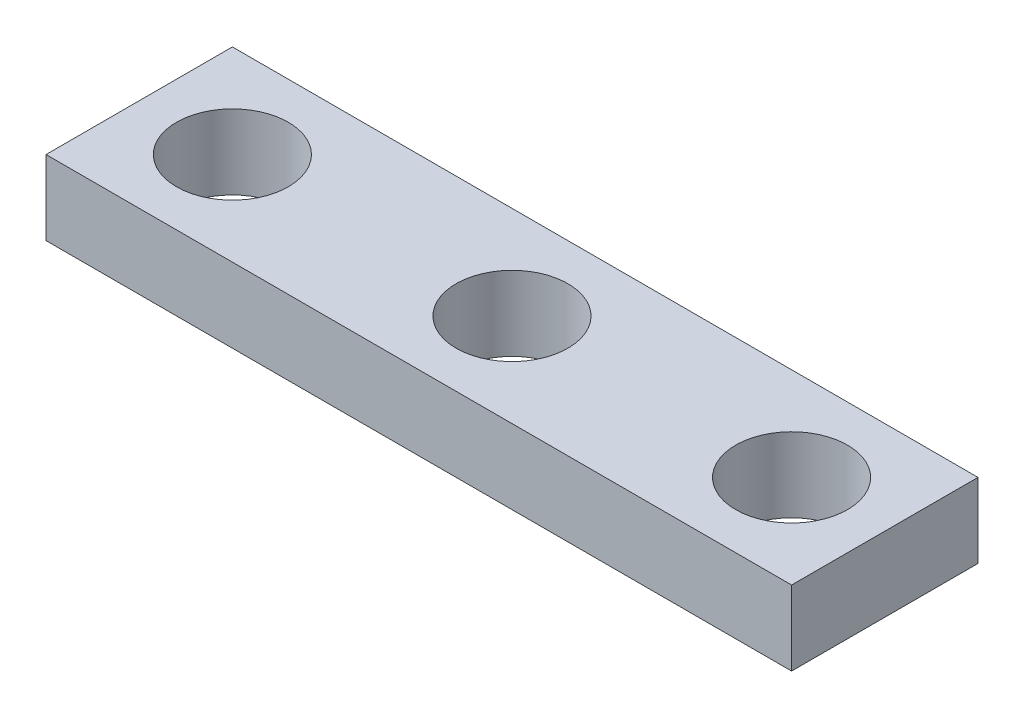
ISO-10303-21;
HEADER;
FILE_DESCRIPTION(('STEP AP214'),'2;1');
FILE_NAME('part.step','',(''),(''),'','','');
FILE_SCHEMA(('AUTOMOTIVE_DESIGN { 1 0 10303 214 1 1 1 1 }'));
ENDSEC;
DATA;
#1=APPLICATION_CONTEXT('core data for automotive mechanical design processes');
#2=APPLICATION_PROTOCOL_DEFINITION('international standard','automotive_design',2000,#1);
#3=PRODUCT_CONTEXT('',#1,'mechanical');
#4=PRODUCT('Part','Part','',(#3));
#5=PRODUCT_RELATED_PRODUCT_CATEGORY('part','',(#4));
#6=PRODUCT_DEFINITION_FORMATION('','',#4);
#7=PRODUCT_DEFINITION_CONTEXT('part definition',#1,'design');
#8=PRODUCT_DEFINITION('design','',#6,#7);
#9=PRODUCT_DEFINITION_SHAPE('','',#8);
#10=(LENGTH_UNIT() NAMED_UNIT(*) SI_UNIT(.MILLI.,.METRE.));
#11=(NAMED_UNIT(*) PLANE_ANGLE_UNIT() SI_UNIT($,.RADIAN.));
#12=(NAMED_UNIT(*) SI_UNIT($,.STERADIAN.) SOLID_ANGLE_UNIT());
#13=UNCERTAINTY_MEASURE_WITH_UNIT(LENGTH_MEASURE(1.E-05),#10,'distance_accuracy_value','');
#14=(GEOMETRIC_REPRESENTATION_CONTEXT(3) GLOBAL_UNCERTAINTY_ASSIGNED_CONTEXT((#13)) GLOBAL_UNIT_ASSIGNED_CONTEXT((#10,
#11,#12)) REPRESENTATION_CONTEXT('',''));
#15=CARTESIAN_POINT('',(0.,0.,0.));
#16=DIRECTION('',(0.,0.,1.));
#17=DIRECTION('',(1.,0.,0.));
#18=AXIS2_PLACEMENT_3D('',#15,#16,#17);
#19=CARTESIAN_POINT('',(0.,2.,0.));
#20=DIRECTION('',(0.,-1.,0.));
#21=DIRECTION('',(0.,0.,-1.));
#22=AXIS2_PLACEMENT_3D('',#19,#20,#21);
#23=PLANE('',#22);
#24=DIRECTION('',(0.,0.,-1.));
#25=VECTOR('',#24,1.);
#26=CARTESIAN_POINT('',(10.,2.,2.5));
#27=LINE('',#26,#25);
#28=CARTESIAN_POINT('',(10.,2.,2.5));
#29=VERTEX_POINT('',#28);
#30=CARTESIAN_POINT('',(10.,2.,-2.5));
#31=VERTEX_POINT('',#30);
#32=EDGE_CURVE('E98',#29,#31,#27,.T.);
#33=ORIENTED_EDGE('',*,*,#32,.T.);
#34=DIRECTION('',(-1.,0.,0.));
#35=VECTOR('',#34,1.);
#36=CARTESIAN_POINT('',(-10.,2.,-2.5));
#37=LINE('',#36,#35);
#38=CARTESIAN_POINT('',(-10.,2.,-2.5));
#39=VERTEX_POINT('',#38);
#40=EDGE_CURVE('E93',#31,#39,#37,.T.);
#41=ORIENTED_EDGE('',*,*,#40,.T.);
#42=DIRECTION('',(0.,0.,1.));
#43=VECTOR('',#42,1.);
#44=CARTESIAN_POINT('',(-10.,2.,2.5));
#45=LINE('',#44,#43);
#46=CARTESIAN_POINT('',(-10.,2.,2.5));
#47=VERTEX_POINT('',#46);
#48=EDGE_CURVE('E96',#39,#47,#45,.T.);
#49=ORIENTED_EDGE('',*,*,#48,.T.);
#50=DIRECTION('',(1.,0.,0.));
#51=VECTOR('',#50,1.);
#52=CARTESIAN_POINT('',(-10.,2.,2.5));
#53=LINE('',#52,#51);
#54=EDGE_CURVE('E63',#47,#29,#53,.T.);
#55=ORIENTED_EDGE('',*,*,#54,.T.);
#56=EDGE_LOOP('',(#33,#41,#49,#55));
#57=FACE_BOUND('',#56,.T.);
#58=CARTESIAN_POINT('',(-7.5,2.,0.));
#59=DIRECTION('',(0.,1.,0.));
#60=DIRECTION('',(0.,0.,1.));
#61=AXIS2_PLACEMENT_3D('',#58,#59,#60);
#62=CIRCLE('',#61,1.5);
#63=CARTESIAN_POINT('',(-7.5,2.,1.5));
#64=VERTEX_POINT('',#63);
#65=EDGE_CURVE('E118',#64,#64,#62,.T.);
#66=ORIENTED_EDGE('',*,*,#65,.F.);
#67=EDGE_LOOP('',(#66));
#68=FACE_BOUND('',#67,.T.);
#69=CARTESIAN_POINT('',(7.5,2.,0.));
#70=DIRECTION('',(0.,1.,0.));
#71=DIRECTION('',(0.,0.,1.));
#72=AXIS2_PLACEMENT_3D('',#69,#70,#71);
#73=CIRCLE('',#72,1.5);
#74=CARTESIAN_POINT('',(7.5,2.,1.5));
#75=VERTEX_POINT('',#74);
#76=EDGE_CURVE('E140',#75,#75,#73,.T.);
#77=ORIENTED_EDGE('',*,*,#76,.F.);
#78=EDGE_LOOP('',(#77));
#79=FACE_BOUND('',#78,.T.);
#80=CARTESIAN_POINT('',(0.,2.,0.));
#81=DIRECTION('',(0.,1.,0.));
#82=DIRECTION('',(0.,0.,1.));
#83=AXIS2_PLACEMENT_3D('',#80,#81,#82);
#84=CIRCLE('',#83,1.5);
#85=CARTESIAN_POINT('',(0.,2.,1.5));
#86=VERTEX_POINT('',#85);
#87=EDGE_CURVE('E148',#86,#86,#84,.T.);
#88=ORIENTED_EDGE('',*,*,#87,.F.);
#89=EDGE_LOOP('',(#88));
#90=FACE_BOUND('',#89,.T.);
#91=ADVANCED_FACE('F45',(#57,#68,#79,#90),#23,.F.);
#92=CARTESIAN_POINT('',(0.,0.,0.));
#93=DIRECTION('',(0.,-1.,0.));
#94=DIRECTION('',(0.,0.,-1.));
#95=AXIS2_PLACEMENT_3D('',#92,#93,#94);
#96=PLANE('',#95);
#97=CARTESIAN_POINT('',(7.5,0.,0.));
#98=DIRECTION('',(0.,1.,0.));
#99=DIRECTION('',(0.,0.,1.));
#100=AXIS2_PLACEMENT_3D('',#97,#98,#99);
#101=CIRCLE('',#100,1.5);
#102=CARTESIAN_POINT('',(7.5,0.,1.5));
#103=VERTEX_POINT('',#102);
#104=EDGE_CURVE('E144',#103,#103,#101,.T.);
#105=ORIENTED_EDGE('',*,*,#104,.T.);
#106=EDGE_LOOP('',(#105));
#107=FACE_BOUND('',#106,.T.);
#108=DIRECTION('',(0.,0.,-1.));
#109=VECTOR('',#108,1.);
#110=CARTESIAN_POINT('',(10.,0.,2.5));
#111=LINE('',#110,#109);
#112=CARTESIAN_POINT('',(10.,0.,2.5));
#113=VERTEX_POINT('',#112);
#114=CARTESIAN_POINT('',(10.,0.,-2.5));
#115=VERTEX_POINT('',#114);
#116=EDGE_CURVE('E114',#113,#115,#111,.T.);
#117=ORIENTED_EDGE('',*,*,#116,.F.);
#118=DIRECTION('',(1.,0.,0.));
#119=VECTOR('',#118,1.);
#120=CARTESIAN_POINT('',(-10.,0.,2.5));
#121=LINE('',#120,#119);
#122=CARTESIAN_POINT('',(-10.,0.,2.5));
#123=VERTEX_POINT('',#122);
#124=EDGE_CURVE('E86',#123,#113,#121,.T.);
#125=ORIENTED_EDGE('',*,*,#124,.F.);
#126=DIRECTION('',(0.,0.,1.));
#127=VECTOR('',#126,1.);
#128=CARTESIAN_POINT('',(-10.,0.,2.5));
#129=LINE('',#128,#127);
#130=CARTESIAN_POINT('',(-10.,0.,-2.5));
#131=VERTEX_POINT('',#130);
#132=EDGE_CURVE('E80',#131,#123,#129,.T.);
#133=ORIENTED_EDGE('',*,*,#132,.F.);
#134=DIRECTION('',(-1.,0.,0.));
#135=VECTOR('',#134,1.);
#136=CARTESIAN_POINT('',(-10.,0.,-2.5));
#137=LINE('',#136,#135);
#138=EDGE_CURVE('E103',#115,#131,#137,.T.);
#139=ORIENTED_EDGE('',*,*,#138,.F.);
#140=EDGE_LOOP('',(#117,#125,#133,#139));
#141=FACE_BOUND('',#140,.T.);
#142=CARTESIAN_POINT('',(-7.5,0.,0.));
#143=DIRECTION('',(0.,1.,0.));
#144=DIRECTION('',(0.,0.,1.));
#145=AXIS2_PLACEMENT_3D('',#142,#143,#144);
#146=CIRCLE('',#145,1.5);
#147=CARTESIAN_POINT('',(-7.5,0.,1.5));
#148=VERTEX_POINT('',#147);
#149=EDGE_CURVE('E136',#148,#148,#146,.T.);
#150=ORIENTED_EDGE('',*,*,#149,.T.);
#151=EDGE_LOOP('',(#150));
#152=FACE_BOUND('',#151,.T.);
#153=CARTESIAN_POINT('',(0.,0.,0.));
#154=DIRECTION('',(0.,1.,0.));
#155=DIRECTION('',(0.,0.,1.));
#156=AXIS2_PLACEMENT_3D('',#153,#154,#155);
#157=CIRCLE('',#156,1.5);
#158=CARTESIAN_POINT('',(0.,0.,1.5));
#159=VERTEX_POINT('',#158);
#160=EDGE_CURVE('E152',#159,#159,#157,.T.);
#161=ORIENTED_EDGE('',*,*,#160,.T.);
#162=EDGE_LOOP('',(#161));
#163=FACE_BOUND('',#162,.T.);
#164=ADVANCED_FACE('F131',(#107,#141,#152,#163),#96,.T.);
#165=CARTESIAN_POINT('',(10.,2.,2.5));
#166=DIRECTION('',(-1.,0.,0.));
#167=DIRECTION('',(0.,0.,1.));
#168=AXIS2_PLACEMENT_3D('',#165,#166,#167);
#169=PLANE('',#168);
#170=ORIENTED_EDGE('',*,*,#116,.T.);
#171=DIRECTION('',(0.,-1.,0.));
#172=VECTOR('',#171,1.);
#173=CARTESIAN_POINT('',(10.,2.,-2.5));
#174=LINE('',#173,#172);
#175=EDGE_CURVE('E11',#31,#115,#174,.T.);
#176=ORIENTED_EDGE('',*,*,#175,.F.);
#177=ORIENTED_EDGE('',*,*,#32,.F.);
#178=DIRECTION('',(0.,-1.,0.));
#179=VECTOR('',#178,1.);
#180=CARTESIAN_POINT('',(10.,2.,2.5));
#181=LINE('',#180,#179);
#182=EDGE_CURVE('E110',#29,#113,#181,.T.);
#183=ORIENTED_EDGE('',*,*,#182,.T.);
#184=EDGE_LOOP('',(#170,#176,#177,#183));
#185=FACE_BOUND('',#184,.T.);
#186=ADVANCED_FACE('F47',(#185),#169,.F.);
#187=CARTESIAN_POINT('',(-10.,2.,-2.5));
#188=DIRECTION('',(0.,0.,1.));
#189=DIRECTION('',(1.,0.,0.));
#190=AXIS2_PLACEMENT_3D('',#187,#188,#189);
#191=PLANE('',#190);
#192=ORIENTED_EDGE('',*,*,#138,.T.);
#193=DIRECTION('',(0.,-1.,0.));
#194=VECTOR('',#193,1.);
#195=CARTESIAN_POINT('',(-10.,2.,-2.5));
#196=LINE('',#195,#194);
#197=EDGE_CURVE('E55',#39,#131,#196,.T.);
#198=ORIENTED_EDGE('',*,*,#197,.F.);
#199=ORIENTED_EDGE('',*,*,#40,.F.);
#200=ORIENTED_EDGE('',*,*,#175,.T.);
#201=EDGE_LOOP('',(#192,#198,#199,#200));
#202=FACE_BOUND('',#201,.T.);
#203=ADVANCED_FACE('F102',(#202),#191,.F.);
#204=CARTESIAN_POINT('',(-10.,2.,2.5));
#205=DIRECTION('',(1.,0.,0.));
#206=DIRECTION('',(0.,0.,-1.));
#207=AXIS2_PLACEMENT_3D('',#204,#205,#206);
#208=PLANE('',#207);
#209=ORIENTED_EDGE('',*,*,#132,.T.);
#210=DIRECTION('',(0.,-1.,0.));
#211=VECTOR('',#210,1.);
#212=CARTESIAN_POINT('',(-10.,2.,2.5));
#213=LINE('',#212,#211);
#214=EDGE_CURVE('E105',#47,#123,#213,.T.);
#215=ORIENTED_EDGE('',*,*,#214,.F.);
#216=ORIENTED_EDGE('',*,*,#48,.F.);
#217=ORIENTED_EDGE('',*,*,#197,.T.);
#218=EDGE_LOOP('',(#209,#215,#216,#217));
#219=FACE_BOUND('',#218,.T.);
#220=ADVANCED_FACE('F106',(#219),#208,.F.);
#221=CARTESIAN_POINT('',(-10.,2.,2.5));
#222=DIRECTION('',(0.,0.,-1.));
#223=DIRECTION('',(-1.,0.,0.));
#224=AXIS2_PLACEMENT_3D('',#221,#222,#223);
#225=PLANE('',#224);
#226=ORIENTED_EDGE('',*,*,#124,.T.);
#227=ORIENTED_EDGE('',*,*,#182,.F.);
#228=ORIENTED_EDGE('',*,*,#54,.F.);
#229=ORIENTED_EDGE('',*,*,#214,.T.);
#230=EDGE_LOOP('',(#226,#227,#228,#229));
#231=FACE_BOUND('',#230,.T.);
#232=ADVANCED_FACE('F128',(#231),#225,.F.);
#233=CARTESIAN_POINT('',(-7.5,2.,0.));
#234=DIRECTION('',(0.,-1.,0.));
#235=DIRECTION('',(0.,0.,-1.));
#236=AXIS2_PLACEMENT_3D('',#233,#234,#235);
#237=CYLINDRICAL_SURFACE('',#236,1.5);
#238=ORIENTED_EDGE('',*,*,#65,.T.);
#239=EDGE_LOOP('',(#238));
#240=FACE_BOUND('',#239,.T.);
#241=ORIENTED_EDGE('',*,*,#149,.F.);
#242=EDGE_LOOP('',(#241));
#243=FACE_BOUND('',#242,.T.);
#244=ADVANCED_FACE('F171',(#240,#243),#237,.F.);
#245=CARTESIAN_POINT('',(7.5,2.,0.));
#246=DIRECTION('',(0.,-1.,0.));
#247=DIRECTION('',(0.,0.,-1.));
#248=AXIS2_PLACEMENT_3D('',#245,#246,#247);
#249=CYLINDRICAL_SURFACE('',#248,1.5);
#250=ORIENTED_EDGE('',*,*,#76,.T.);
#251=EDGE_LOOP('',(#250));
#252=FACE_BOUND('',#251,.T.);
#253=ORIENTED_EDGE('',*,*,#104,.F.);
#254=EDGE_LOOP('',(#253));
#255=FACE_BOUND('',#254,.T.);
#256=ADVANCED_FACE('F216',(#252,#255),#249,.F.);
#257=CARTESIAN_POINT('',(0.,2.,0.));
#258=DIRECTION('',(0.,-1.,0.));
#259=DIRECTION('',(0.,0.,-1.));
#260=AXIS2_PLACEMENT_3D('',#257,#258,#259);
#261=CYLINDRICAL_SURFACE('',#260,1.5);
#262=ORIENTED_EDGE('',*,*,#87,.T.);
#263=EDGE_LOOP('',(#262));
#264=FACE_BOUND('',#263,.T.);
#265=ORIENTED_EDGE('',*,*,#160,.F.);
#266=EDGE_LOOP('',(#265));
#267=FACE_BOUND('',#266,.T.);
#268=ADVANCED_FACE('F160',(#264,#267),#261,.F.);
#269=CLOSED_SHELL('',(#91,#164,#186,#203,#220,#232,#244,#256,#268));
#270=MANIFOLD_SOLID_BREP('B2',#269);
#271=ADVANCED_BREP_SHAPE_REPRESENTATION('',(#18,#270),#14);
#272=SHAPE_DEFINITION_REPRESENTATION(#9,#271);
ENDSEC;
END-ISO-10303-21;
